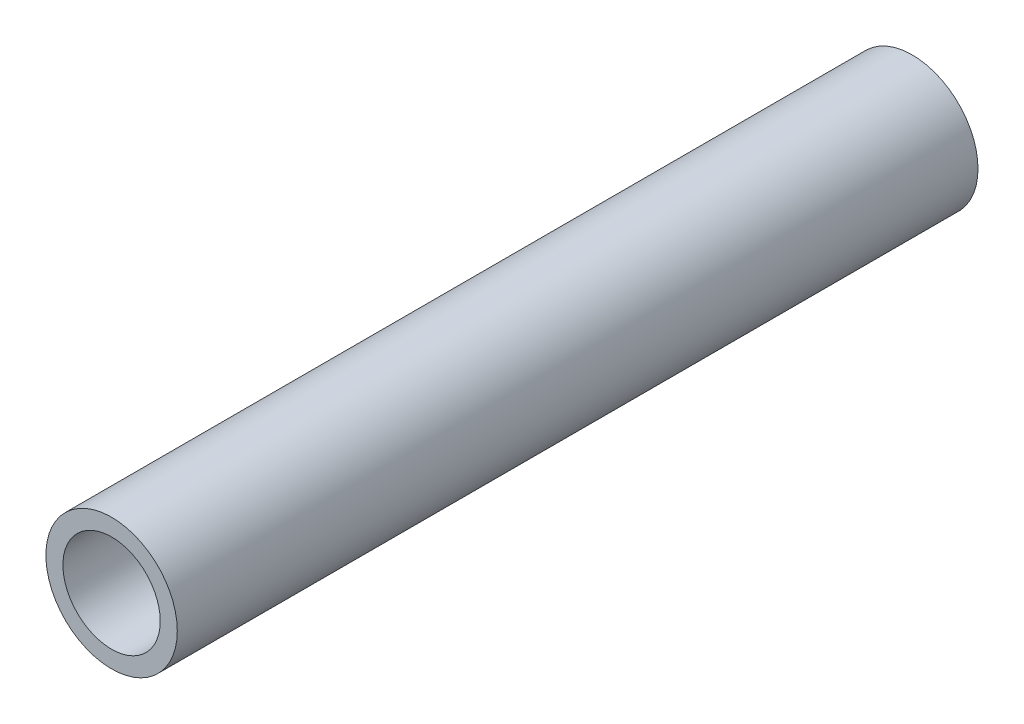
ISO-10303-21;
HEADER;
FILE_DESCRIPTION(('STEP AP214'),'2;1');
FILE_NAME('part.step','',(''),(''),'','','');
FILE_SCHEMA(('AUTOMOTIVE_DESIGN { 1 0 10303 214 1 1 1 1 }'));
ENDSEC;
DATA;
#1=APPLICATION_CONTEXT('core data for automotive mechanical design processes');
#2=APPLICATION_PROTOCOL_DEFINITION('international standard','automotive_design',2000,#1);
#3=PRODUCT_CONTEXT('',#1,'mechanical');
#4=PRODUCT('Part','Part','',(#3));
#5=PRODUCT_RELATED_PRODUCT_CATEGORY('part','',(#4));
#6=PRODUCT_DEFINITION_FORMATION('','',#4);
#7=PRODUCT_DEFINITION_CONTEXT('part definition',#1,'design');
#8=PRODUCT_DEFINITION('design','',#6,#7);
#9=PRODUCT_DEFINITION_SHAPE('','',#8);
#10=(LENGTH_UNIT() NAMED_UNIT(*) SI_UNIT(.MILLI.,.METRE.));
#11=(NAMED_UNIT(*) PLANE_ANGLE_UNIT() SI_UNIT($,.RADIAN.));
#12=(NAMED_UNIT(*) SI_UNIT($,.STERADIAN.) SOLID_ANGLE_UNIT());
#13=UNCERTAINTY_MEASURE_WITH_UNIT(LENGTH_MEASURE(1.E-05),#10,'distance_accuracy_value','');
#14=(GEOMETRIC_REPRESENTATION_CONTEXT(3) GLOBAL_UNCERTAINTY_ASSIGNED_CONTEXT((#13)) GLOBAL_UNIT_ASSIGNED_CONTEXT((#10,
#11,#12)) REPRESENTATION_CONTEXT('',''));
#15=CARTESIAN_POINT('',(0.,0.,0.));
#16=DIRECTION('',(0.,0.,1.));
#17=DIRECTION('',(1.,0.,0.));
#18=AXIS2_PLACEMENT_3D('',#15,#16,#17);
#19=CARTESIAN_POINT('',(0.,0.,65.));
#20=DIRECTION('',(0.,0.,1.));
#21=DIRECTION('',(1.,0.,0.));
#22=AXIS2_PLACEMENT_3D('',#19,#20,#21);
#23=PLANE('',#22);
#24=CARTESIAN_POINT('',(0.,0.,65.));
#25=DIRECTION('',(0.,0.,1.));
#26=DIRECTION('',(1.,0.,0.));
#27=AXIS2_PLACEMENT_3D('',#24,#25,#26);
#28=CIRCLE('',#27,10.668);
#29=CARTESIAN_POINT('',(10.668,0.,65.));
#30=VERTEX_POINT('',#29);
#31=EDGE_CURVE('E11',#30,#30,#28,.T.);
#32=ORIENTED_EDGE('',*,*,#31,.T.);
#33=EDGE_LOOP('',(#32));
#34=FACE_BOUND('',#33,.T.);
#35=CARTESIAN_POINT('',(0.,0.,65.));
#36=DIRECTION('',(0.,0.,1.));
#37=DIRECTION('',(1.,0.,0.));
#38=AXIS2_PLACEMENT_3D('',#35,#36,#37);
#39=CIRCLE('',#38,7.8994);
#40=CARTESIAN_POINT('',(7.8994,0.,65.));
#41=VERTEX_POINT('',#40);
#42=EDGE_CURVE('E56',#41,#41,#39,.T.);
#43=ORIENTED_EDGE('',*,*,#42,.F.);
#44=EDGE_LOOP('',(#43));
#45=FACE_BOUND('',#44,.T.);
#46=ADVANCED_FACE('F43',(#34,#45),#23,.T.);
#47=CARTESIAN_POINT('',(0.,0.,-65.));
#48=DIRECTION('',(0.,0.,1.));
#49=DIRECTION('',(1.,0.,0.));
#50=AXIS2_PLACEMENT_3D('',#47,#48,#49);
#51=PLANE('',#50);
#52=CARTESIAN_POINT('',(0.,0.,-65.));
#53=DIRECTION('',(0.,0.,1.));
#54=DIRECTION('',(1.,0.,0.));
#55=AXIS2_PLACEMENT_3D('',#52,#53,#54);
#56=CIRCLE('',#55,10.668);
#57=CARTESIAN_POINT('',(10.668,0.,-65.));
#58=VERTEX_POINT('',#57);
#59=EDGE_CURVE('E47',#58,#58,#56,.T.);
#60=ORIENTED_EDGE('',*,*,#59,.F.);
#61=EDGE_LOOP('',(#60));
#62=FACE_BOUND('',#61,.T.);
#63=CARTESIAN_POINT('',(0.,0.,-65.));
#64=DIRECTION('',(0.,0.,1.));
#65=DIRECTION('',(1.,0.,0.));
#66=AXIS2_PLACEMENT_3D('',#63,#64,#65);
#67=CIRCLE('',#66,7.8994);
#68=CARTESIAN_POINT('',(7.8994,0.,-65.));
#69=VERTEX_POINT('',#68);
#70=EDGE_CURVE('E58',#69,#69,#67,.T.);
#71=ORIENTED_EDGE('',*,*,#70,.T.);
#72=EDGE_LOOP('',(#71));
#73=FACE_BOUND('',#72,.T.);
#74=ADVANCED_FACE('F70',(#62,#73),#51,.F.);
#75=CARTESIAN_POINT('',(0.,0.,65.));
#76=DIRECTION('',(0.,0.,-1.));
#77=DIRECTION('',(-1.,0.,0.));
#78=AXIS2_PLACEMENT_3D('',#75,#76,#77);
#79=CYLINDRICAL_SURFACE('',#78,10.668);
#80=ORIENTED_EDGE('',*,*,#31,.F.);
#81=EDGE_LOOP('',(#80));
#82=FACE_BOUND('',#81,.T.);
#83=ORIENTED_EDGE('',*,*,#59,.T.);
#84=EDGE_LOOP('',(#83));
#85=FACE_BOUND('',#84,.T.);
#86=ADVANCED_FACE('F45',(#82,#85),#79,.T.);
#87=CARTESIAN_POINT('',(0.,0.,65.));
#88=DIRECTION('',(0.,0.,-1.));
#89=DIRECTION('',(-1.,0.,0.));
#90=AXIS2_PLACEMENT_3D('',#87,#88,#89);
#91=CYLINDRICAL_SURFACE('',#90,7.8994);
#92=ORIENTED_EDGE('',*,*,#42,.T.);
#93=EDGE_LOOP('',(#92));
#94=FACE_BOUND('',#93,.T.);
#95=ORIENTED_EDGE('',*,*,#70,.F.);
#96=EDGE_LOOP('',(#95));
#97=FACE_BOUND('',#96,.T.);
#98=ADVANCED_FACE('F66',(#94,#97),#91,.F.);
#99=CLOSED_SHELL('',(#46,#74,#86,#98));
#100=MANIFOLD_SOLID_BREP('B2',#99);
#101=ADVANCED_BREP_SHAPE_REPRESENTATION('',(#18,#100),#14);
#102=SHAPE_DEFINITION_REPRESENTATION(#9,#101);
ENDSEC;
END-ISO-10303-21;
